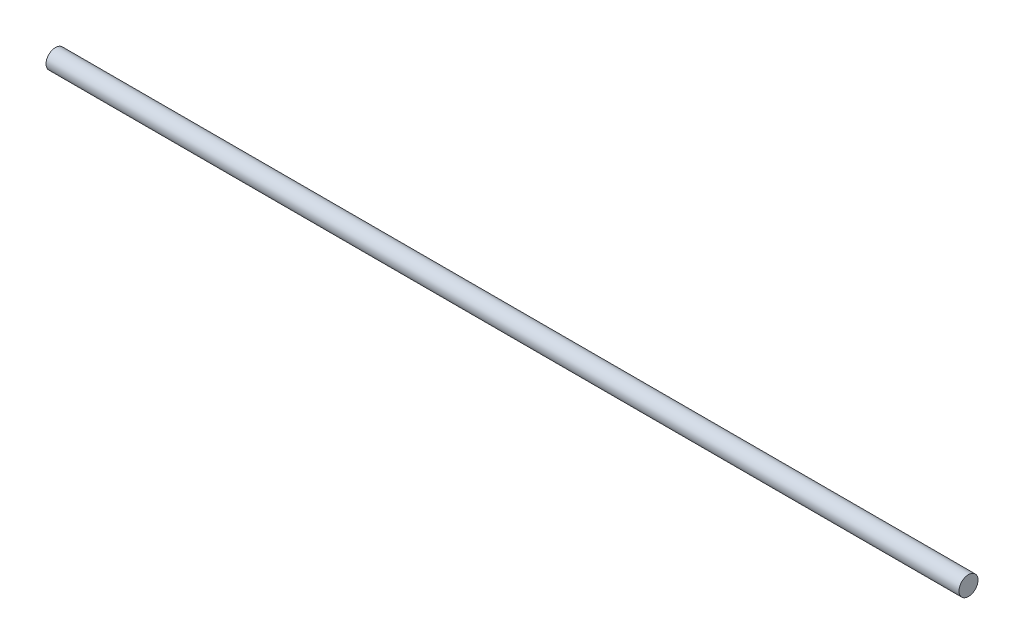
ISO-10303-21;
HEADER;
FILE_DESCRIPTION(('STEP AP214'),'2;1');
FILE_NAME('part.step','',(''),(''),'','','');
FILE_SCHEMA(('AUTOMOTIVE_DESIGN { 1 0 10303 214 1 1 1 1 }'));
ENDSEC;
DATA;
#1=APPLICATION_CONTEXT('core data for automotive mechanical design processes');
#2=APPLICATION_PROTOCOL_DEFINITION('international standard','automotive_design',2000,#1);
#3=PRODUCT_CONTEXT('',#1,'mechanical');
#4=PRODUCT('Part','Part','',(#3));
#5=PRODUCT_RELATED_PRODUCT_CATEGORY('part','',(#4));
#6=PRODUCT_DEFINITION_FORMATION('','',#4);
#7=PRODUCT_DEFINITION_CONTEXT('part definition',#1,'design');
#8=PRODUCT_DEFINITION('design','',#6,#7);
#9=PRODUCT_DEFINITION_SHAPE('','',#8);
#10=(LENGTH_UNIT() NAMED_UNIT(*) SI_UNIT(.MILLI.,.METRE.));
#11=(NAMED_UNIT(*) PLANE_ANGLE_UNIT() SI_UNIT($,.RADIAN.));
#12=(NAMED_UNIT(*) SI_UNIT($,.STERADIAN.) SOLID_ANGLE_UNIT());
#13=UNCERTAINTY_MEASURE_WITH_UNIT(LENGTH_MEASURE(1.E-05),#10,'distance_accuracy_value','');
#14=(GEOMETRIC_REPRESENTATION_CONTEXT(3) GLOBAL_UNCERTAINTY_ASSIGNED_CONTEXT((#13)) GLOBAL_UNIT_ASSIGNED_CONTEXT((#10,
#11,#12)) REPRESENTATION_CONTEXT('',''));
#15=CARTESIAN_POINT('',(0.,0.,0.));
#16=DIRECTION('',(0.,0.,1.));
#17=DIRECTION('',(1.,0.,0.));
#18=AXIS2_PLACEMENT_3D('',#15,#16,#17);
#19=CARTESIAN_POINT('',(304.8,0.,0.));
#20=DIRECTION('',(-1.,0.,0.));
#21=DIRECTION('',(0.,0.,1.));
#22=AXIS2_PLACEMENT_3D('',#19,#20,#21);
#23=CYLINDRICAL_SURFACE('',#22,3.175);
#24=CARTESIAN_POINT('',(304.8,0.,0.));
#25=DIRECTION('',(1.,0.,0.));
#26=DIRECTION('',(0.,0.,-1.));
#27=AXIS2_PLACEMENT_3D('',#24,#25,#26);
#28=CIRCLE('',#27,3.175);
#29=CARTESIAN_POINT('',(304.8,0.,3.175));
#30=VERTEX_POINT('',#29);
#31=EDGE_CURVE('E10',#30,#30,#28,.T.);
#32=CARTESIAN_POINT('',(0.,0.,0.));
#33=DIRECTION('',(1.,0.,0.));
#34=DIRECTION('',(0.,0.,-1.));
#35=AXIS2_PLACEMENT_3D('',#32,#33,#34);
#36=CIRCLE('',#35,3.175);
#37=CARTESIAN_POINT('',(0.,0.,3.175));
#38=VERTEX_POINT('',#37);
#39=EDGE_CURVE('E39',#38,#38,#36,.T.);
#40=CARTESIAN_POINT('',(304.8,0.,3.175));
#41=CARTESIAN_POINT('',(301.625,0.,3.175));
#42=CARTESIAN_POINT('',(298.45,0.,3.175));
#43=CARTESIAN_POINT('',(292.1,0.,3.175));
#44=CARTESIAN_POINT('',(288.925,0.,3.175));
#45=CARTESIAN_POINT('',(282.575,0.,3.175));
#46=CARTESIAN_POINT('',(279.4,0.,3.175));
#47=CARTESIAN_POINT('',(273.05,0.,3.175));
#48=CARTESIAN_POINT('',(269.875,0.,3.175));
#49=CARTESIAN_POINT('',(263.525,0.,3.175));
#50=CARTESIAN_POINT('',(260.35,0.,3.175));
#51=CARTESIAN_POINT('',(254.,0.,3.175));
#52=CARTESIAN_POINT('',(250.825,0.,3.175));
#53=CARTESIAN_POINT('',(244.475,0.,3.175));
#54=CARTESIAN_POINT('',(241.3,0.,3.175));
#55=CARTESIAN_POINT('',(234.95,0.,3.175));
#56=CARTESIAN_POINT('',(231.775,0.,3.175));
#57=CARTESIAN_POINT('',(225.425,0.,3.175));
#58=CARTESIAN_POINT('',(222.25,0.,3.175));
#59=CARTESIAN_POINT('',(215.9,0.,3.175));
#60=CARTESIAN_POINT('',(212.725,0.,3.175));
#61=CARTESIAN_POINT('',(206.375,0.,3.175));
#62=CARTESIAN_POINT('',(203.2,0.,3.175));
#63=CARTESIAN_POINT('',(196.85,0.,3.175));
#64=CARTESIAN_POINT('',(193.675,0.,3.175));
#65=CARTESIAN_POINT('',(187.325,0.,3.175));
#66=CARTESIAN_POINT('',(184.15,0.,3.175));
#67=CARTESIAN_POINT('',(177.8,0.,3.175));
#68=CARTESIAN_POINT('',(174.625,0.,3.175));
#69=CARTESIAN_POINT('',(168.275,0.,3.175));
#70=CARTESIAN_POINT('',(165.1,0.,3.175));
#71=CARTESIAN_POINT('',(158.75,0.,3.175));
#72=CARTESIAN_POINT('',(155.575,0.,3.175));
#73=CARTESIAN_POINT('',(149.225,0.,3.175));
#74=CARTESIAN_POINT('',(146.05,0.,3.175));
#75=CARTESIAN_POINT('',(139.7,0.,3.175));
#76=CARTESIAN_POINT('',(136.525,0.,3.175));
#77=CARTESIAN_POINT('',(130.175,0.,3.175));
#78=CARTESIAN_POINT('',(127.,0.,3.175));
#79=CARTESIAN_POINT('',(120.65,0.,3.175));
#80=CARTESIAN_POINT('',(117.475,0.,3.175));
#81=CARTESIAN_POINT('',(111.125,0.,3.175));
#82=CARTESIAN_POINT('',(107.95,0.,3.175));
#83=CARTESIAN_POINT('',(101.6,0.,3.175));
#84=CARTESIAN_POINT('',(98.425,0.,3.175));
#85=CARTESIAN_POINT('',(92.075,0.,3.175));
#86=CARTESIAN_POINT('',(88.9,0.,3.175));
#87=CARTESIAN_POINT('',(82.55,0.,3.175));
#88=CARTESIAN_POINT('',(79.375,0.,3.175));
#89=CARTESIAN_POINT('',(73.025,0.,3.175));
#90=CARTESIAN_POINT('',(69.85,0.,3.175));
#91=CARTESIAN_POINT('',(63.5,0.,3.175));
#92=CARTESIAN_POINT('',(60.325,0.,3.175));
#93=CARTESIAN_POINT('',(53.975,0.,3.175));
#94=CARTESIAN_POINT('',(50.8,0.,3.175));
#95=CARTESIAN_POINT('',(44.45,0.,3.175));
#96=CARTESIAN_POINT('',(41.275,0.,3.175));
#97=CARTESIAN_POINT('',(34.925,0.,3.175));
#98=CARTESIAN_POINT('',(31.75,0.,3.175));
#99=CARTESIAN_POINT('',(25.4,0.,3.175));
#100=CARTESIAN_POINT('',(22.225,0.,3.175));
#101=CARTESIAN_POINT('',(15.875,0.,3.175));
#102=CARTESIAN_POINT('',(12.7,0.,3.175));
#103=CARTESIAN_POINT('',(6.35,0.,3.175));
#104=CARTESIAN_POINT('',(3.175,0.,3.175));
#105=CARTESIAN_POINT('',(0.,0.,3.175));
#106=B_SPLINE_CURVE_WITH_KNOTS('',3,(#40,#41,#42,#43,#44,#45,#46,#47,#48,#49,#50,#51,#52,#53,
#54,#55,#56,#57,#58,#59,#60,#61,#62,#63,#64,#65,#66,#67,#68,#69,#70,#71,#72,#73,#74,#75,#76,#77,
#78,#79,#80,#81,#82,#83,#84,#85,#86,#87,#88,#89,#90,#91,#92,#93,#94,#95,#96,#97,#98,#99,#100,
#101,#102,#103,#104,#105),.UNSPECIFIED.,.F.,.F.,(4,2,2,2,2,2,2,2,2,2,2,2,2,2,2,2,2,2,2,2,2,2,2,
2,2,2,2,2,2,2,2,2,4),(0.,9.52499999999995,19.05,28.575,38.1,47.625,57.15,66.675,76.2,85.725,
95.2499999999999,104.775,114.3,123.825,133.35,142.875,152.4,161.925,171.45,180.975,190.5,
200.025,209.55,219.075,228.6,238.125,247.65,257.175,266.7,276.225,285.75,295.275,304.8),.UNSPECIFIED.);
#107=EDGE_CURVE('BSEAM36',#30,#38,#106,.T.);
#108=ORIENTED_EDGE('',*,*,#31,.F.);
#109=ORIENTED_EDGE('',*,*,#39,.T.);
#110=ORIENTED_EDGE('',*,*,#107,.T.);
#111=ORIENTED_EDGE('',*,*,#107,.F.);
#112=EDGE_LOOP('',(#108,#110,#109,#111));
#113=FACE_BOUND('',#112,.T.);
#114=ADVANCED_FACE('F36',(#113),#23,.T.);
#115=CARTESIAN_POINT('',(304.8,0.,0.));
#116=DIRECTION('',(1.,0.,0.));
#117=DIRECTION('',(0.,0.,-1.));
#118=AXIS2_PLACEMENT_3D('',#115,#116,#117);
#119=PLANE('',#118);
#120=ORIENTED_EDGE('',*,*,#31,.T.);
#121=EDGE_LOOP('',(#120));
#122=FACE_BOUND('',#121,.T.);
#123=ADVANCED_FACE('F51',(#122),#119,.T.);
#124=CARTESIAN_POINT('',(0.,0.,0.));
#125=DIRECTION('',(1.,0.,0.));
#126=DIRECTION('',(0.,0.,-1.));
#127=AXIS2_PLACEMENT_3D('',#124,#125,#126);
#128=PLANE('',#127);
#129=ORIENTED_EDGE('',*,*,#39,.F.);
#130=EDGE_LOOP('',(#129));
#131=FACE_BOUND('',#130,.T.);
#132=ADVANCED_FACE('F49',(#131),#128,.F.);
#133=CLOSED_SHELL('',(#114,#123,#132));
#134=MANIFOLD_SOLID_BREP('B2',#133);
#135=ADVANCED_BREP_SHAPE_REPRESENTATION('',(#18,#134),#14);
#136=SHAPE_DEFINITION_REPRESENTATION(#9,#135);
ENDSEC;
END-ISO-10303-21;
